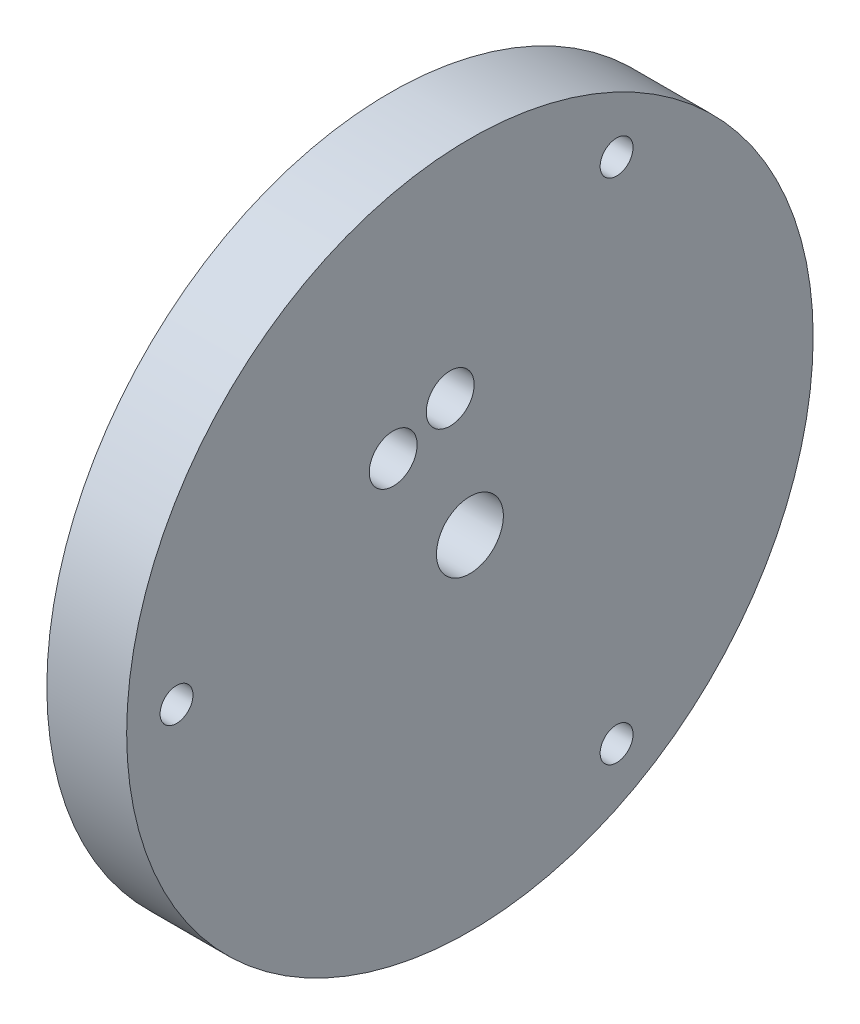
ISO-10303-21;
HEADER;
FILE_DESCRIPTION(('STEP AP214'),'2;1');
FILE_NAME('part.step','',(''),(''),'','','');
FILE_SCHEMA(('AUTOMOTIVE_DESIGN { 1 0 10303 214 1 1 1 1 }'));
ENDSEC;
DATA;
#1=APPLICATION_CONTEXT('core data for automotive mechanical design processes');
#2=APPLICATION_PROTOCOL_DEFINITION('international standard','automotive_design',2000,#1);
#3=PRODUCT_CONTEXT('',#1,'mechanical');
#4=PRODUCT('Part','Part','',(#3));
#5=PRODUCT_RELATED_PRODUCT_CATEGORY('part','',(#4));
#6=PRODUCT_DEFINITION_FORMATION('','',#4);
#7=PRODUCT_DEFINITION_CONTEXT('part definition',#1,'design');
#8=PRODUCT_DEFINITION('design','',#6,#7);
#9=PRODUCT_DEFINITION_SHAPE('','',#8);
#10=(LENGTH_UNIT() NAMED_UNIT(*) SI_UNIT(.MILLI.,.METRE.));
#11=(NAMED_UNIT(*) PLANE_ANGLE_UNIT() SI_UNIT($,.RADIAN.));
#12=(NAMED_UNIT(*) SI_UNIT($,.STERADIAN.) SOLID_ANGLE_UNIT());
#13=UNCERTAINTY_MEASURE_WITH_UNIT(LENGTH_MEASURE(1.E-05),#10,'distance_accuracy_value','');
#14=(GEOMETRIC_REPRESENTATION_CONTEXT(3) GLOBAL_UNCERTAINTY_ASSIGNED_CONTEXT((#13)) GLOBAL_UNIT_ASSIGNED_CONTEXT((#10,
#11,#12)) REPRESENTATION_CONTEXT('',''));
#15=CARTESIAN_POINT('',(0.,0.,0.));
#16=DIRECTION('',(0.,0.,1.));
#17=DIRECTION('',(1.,0.,0.));
#18=AXIS2_PLACEMENT_3D('',#15,#16,#17);
#19=CARTESIAN_POINT('',(148.7,34.4,0.));
#20=DIRECTION('',(1.,0.,0.));
#21=DIRECTION('',(0.,0.,-1.));
#22=AXIS2_PLACEMENT_3D('',#19,#20,#21);
#23=PLANE('',#22);
#24=CARTESIAN_POINT('',(148.7,0.,12.));
#25=DIRECTION('',(1.,0.,0.));
#26=DIRECTION('',(0.,0.,-1.));
#27=AXIS2_PLACEMENT_3D('',#24,#25,#26);
#28=CIRCLE('',#27,1.65);
#29=CARTESIAN_POINT('',(148.7,0.,10.35));
#30=VERTEX_POINT('',#29);
#31=EDGE_CURVE('E93',#30,#30,#28,.T.);
#32=ORIENTED_EDGE('',*,*,#31,.T.);
#33=EDGE_LOOP('',(#32));
#34=FACE_BOUND('',#33,.T.);
#35=CARTESIAN_POINT('',(148.7,-10.3923048454133,-6.));
#36=DIRECTION('',(1.,0.,0.));
#37=DIRECTION('',(0.,0.,-1.));
#38=AXIS2_PLACEMENT_3D('',#35,#36,#37);
#39=CIRCLE('',#38,1.65);
#40=CARTESIAN_POINT('',(148.7,-10.3923048454133,-7.65));
#41=VERTEX_POINT('',#40);
#42=EDGE_CURVE('E87',#41,#41,#39,.T.);
#43=ORIENTED_EDGE('',*,*,#42,.T.);
#44=EDGE_LOOP('',(#43));
#45=FACE_BOUND('',#44,.T.);
#46=CARTESIAN_POINT('',(148.7,10.3923048454133,-6.00000000000001));
#47=DIRECTION('',(1.,0.,0.));
#48=DIRECTION('',(0.,0.,-1.));
#49=AXIS2_PLACEMENT_3D('',#46,#47,#48);
#50=CIRCLE('',#49,1.65);
#51=CARTESIAN_POINT('',(148.7,10.3923048454133,-7.65000000000001));
#52=VERTEX_POINT('',#51);
#53=EDGE_CURVE('E81',#52,#52,#50,.T.);
#54=ORIENTED_EDGE('',*,*,#53,.T.);
#55=EDGE_LOOP('',(#54));
#56=FACE_BOUND('',#55,.T.);
#57=CARTESIAN_POINT('',(148.7,25.4611468712625,-14.7));
#58=DIRECTION('',(1.,0.,0.));
#59=DIRECTION('',(0.,0.,-1.));
#60=AXIS2_PLACEMENT_3D('',#57,#58,#59);
#61=CIRCLE('',#60,1.65);
#62=CARTESIAN_POINT('',(148.7,25.4611468712625,-16.35));
#63=VERTEX_POINT('',#62);
#64=EDGE_CURVE('E50',#63,#63,#61,.F.);
#65=ORIENTED_EDGE('',*,*,#64,.F.);
#66=EDGE_LOOP('',(#65));
#67=FACE_BOUND('',#66,.T.);
#68=CARTESIAN_POINT('',(148.7,-25.4611468712625,-14.7));
#69=DIRECTION('',(1.,0.,0.));
#70=DIRECTION('',(0.,0.,-1.));
#71=AXIS2_PLACEMENT_3D('',#68,#69,#70);
#72=CIRCLE('',#71,1.65);
#73=CARTESIAN_POINT('',(148.7,-25.4611468712625,-16.35));
#74=VERTEX_POINT('',#73);
#75=EDGE_CURVE('E53',#74,#74,#72,.F.);
#76=ORIENTED_EDGE('',*,*,#75,.F.);
#77=EDGE_LOOP('',(#76));
#78=FACE_BOUND('',#77,.T.);
#79=CARTESIAN_POINT('',(148.7,0.,29.4));
#80=DIRECTION('',(1.,0.,0.));
#81=DIRECTION('',(0.,0.,-1.));
#82=AXIS2_PLACEMENT_3D('',#79,#80,#81);
#83=CIRCLE('',#82,1.65);
#84=CARTESIAN_POINT('',(148.7,0.,27.75));
#85=VERTEX_POINT('',#84);
#86=EDGE_CURVE('E56',#85,#85,#83,.F.);
#87=ORIENTED_EDGE('',*,*,#86,.F.);
#88=EDGE_LOOP('',(#87));
#89=FACE_BOUND('',#88,.T.);
#90=CARTESIAN_POINT('',(148.7,10.4836474229945,7.68720604058077));
#91=DIRECTION('',(1.,0.,0.));
#92=DIRECTION('',(0.,0.,-1.));
#93=AXIS2_PLACEMENT_3D('',#90,#91,#92);
#94=CIRCLE('',#93,2.4);
#95=CARTESIAN_POINT('',(148.7,10.4836474229945,5.28720604058077));
#96=VERTEX_POINT('',#95);
#97=EDGE_CURVE('E59',#96,#96,#94,.F.);
#98=ORIENTED_EDGE('',*,*,#97,.F.);
#99=EDGE_LOOP('',(#98));
#100=FACE_BOUND('',#99,.T.);
#101=CARTESIAN_POINT('',(148.7,12.8487337040411,1.97738266469541));
#102=DIRECTION('',(1.,0.,0.));
#103=DIRECTION('',(0.,0.,-1.));
#104=AXIS2_PLACEMENT_3D('',#101,#102,#103);
#105=CIRCLE('',#104,2.4);
#106=CARTESIAN_POINT('',(148.7,12.8487337040411,-0.422617335304591));
#107=VERTEX_POINT('',#106);
#108=EDGE_CURVE('E62',#107,#107,#105,.F.);
#109=ORIENTED_EDGE('',*,*,#108,.F.);
#110=EDGE_LOOP('',(#109));
#111=FACE_BOUND('',#110,.T.);
#112=CARTESIAN_POINT('',(148.7,0.,0.));
#113=DIRECTION('',(-1.,0.,0.));
#114=DIRECTION('',(0.,0.,1.));
#115=AXIS2_PLACEMENT_3D('',#112,#113,#114);
#116=CIRCLE('',#115,3.35);
#117=CARTESIAN_POINT('',(148.7,0.,3.35));
#118=VERTEX_POINT('',#117);
#119=EDGE_CURVE('E10',#118,#118,#116,.T.);
#120=ORIENTED_EDGE('',*,*,#119,.F.);
#121=EDGE_LOOP('',(#120));
#122=FACE_BOUND('',#121,.T.);
#123=CARTESIAN_POINT('',(148.7,0.,0.));
#124=DIRECTION('',(-1.,0.,0.));
#125=DIRECTION('',(0.,0.,1.));
#126=AXIS2_PLACEMENT_3D('',#123,#124,#125);
#127=CIRCLE('',#126,34.4);
#128=CARTESIAN_POINT('',(148.7,0.,34.4));
#129=VERTEX_POINT('',#128);
#130=EDGE_CURVE('E45',#129,#129,#127,.T.);
#131=ORIENTED_EDGE('',*,*,#130,.T.);
#132=EDGE_LOOP('',(#131));
#133=FACE_BOUND('',#132,.T.);
#134=ADVANCED_FACE('F31',(#34,#45,#56,#67,#78,#89,#100,#111,#122,#133),#23,.F.);
#135=CARTESIAN_POINT('',(-110.,0.,0.));
#136=DIRECTION('',(-1.,0.,0.));
#137=DIRECTION('',(0.,0.,1.));
#138=AXIS2_PLACEMENT_3D('',#135,#136,#137);
#139=CYLINDRICAL_SURFACE('',#138,3.35);
#140=CARTESIAN_POINT('',(156.7,0.,0.));
#141=DIRECTION('',(-1.,0.,0.));
#142=DIRECTION('',(0.,0.,1.));
#143=AXIS2_PLACEMENT_3D('',#140,#141,#142);
#144=CIRCLE('',#143,3.35);
#145=CARTESIAN_POINT('',(156.7,0.,3.35));
#146=VERTEX_POINT('',#145);
#147=EDGE_CURVE('E37',#146,#146,#144,.T.);
#148=ORIENTED_EDGE('',*,*,#147,.F.);
#149=EDGE_LOOP('',(#148));
#150=FACE_BOUND('',#149,.T.);
#151=ORIENTED_EDGE('',*,*,#119,.T.);
#152=EDGE_LOOP('',(#151));
#153=FACE_BOUND('',#152,.T.);
#154=ADVANCED_FACE('F111',(#150,#153),#139,.F.);
#155=CARTESIAN_POINT('',(156.7,3.35,0.));
#156=DIRECTION('',(-1.,0.,0.));
#157=DIRECTION('',(0.,0.,1.));
#158=AXIS2_PLACEMENT_3D('',#155,#156,#157);
#159=PLANE('',#158);
#160=CARTESIAN_POINT('',(156.7,25.4611468712625,-14.7));
#161=DIRECTION('',(1.,0.,0.));
#162=DIRECTION('',(0.,0.,-1.));
#163=AXIS2_PLACEMENT_3D('',#160,#161,#162);
#164=CIRCLE('',#163,1.65);
#165=CARTESIAN_POINT('',(156.7,25.4611468712625,-16.35));
#166=VERTEX_POINT('',#165);
#167=EDGE_CURVE('E69',#166,#166,#164,.T.);
#168=ORIENTED_EDGE('',*,*,#167,.F.);
#169=EDGE_LOOP('',(#168));
#170=FACE_BOUND('',#169,.T.);
#171=CARTESIAN_POINT('',(156.7,-25.4611468712625,-14.7));
#172=DIRECTION('',(1.,0.,0.));
#173=DIRECTION('',(0.,0.,-1.));
#174=AXIS2_PLACEMENT_3D('',#171,#172,#173);
#175=CIRCLE('',#174,1.65);
#176=CARTESIAN_POINT('',(156.7,-25.4611468712625,-16.35));
#177=VERTEX_POINT('',#176);
#178=EDGE_CURVE('E72',#177,#177,#175,.T.);
#179=ORIENTED_EDGE('',*,*,#178,.F.);
#180=EDGE_LOOP('',(#179));
#181=FACE_BOUND('',#180,.T.);
#182=CARTESIAN_POINT('',(156.7,0.,29.4));
#183=DIRECTION('',(1.,0.,0.));
#184=DIRECTION('',(0.,0.,-1.));
#185=AXIS2_PLACEMENT_3D('',#182,#183,#184);
#186=CIRCLE('',#185,1.65);
#187=CARTESIAN_POINT('',(156.7,0.,27.75));
#188=VERTEX_POINT('',#187);
#189=EDGE_CURVE('E76',#188,#188,#186,.T.);
#190=ORIENTED_EDGE('',*,*,#189,.F.);
#191=EDGE_LOOP('',(#190));
#192=FACE_BOUND('',#191,.T.);
#193=CARTESIAN_POINT('',(156.7,10.4836474229945,7.68720604058077));
#194=DIRECTION('',(1.,0.,0.));
#195=DIRECTION('',(0.,0.,-1.));
#196=AXIS2_PLACEMENT_3D('',#193,#194,#195);
#197=CIRCLE('',#196,2.4);
#198=CARTESIAN_POINT('',(156.7,10.4836474229945,5.28720604058077));
#199=VERTEX_POINT('',#198);
#200=EDGE_CURVE('E68',#199,#199,#197,.T.);
#201=ORIENTED_EDGE('',*,*,#200,.F.);
#202=EDGE_LOOP('',(#201));
#203=FACE_BOUND('',#202,.T.);
#204=CARTESIAN_POINT('',(156.7,12.8487337040411,1.97738266469541));
#205=DIRECTION('',(1.,0.,0.));
#206=DIRECTION('',(0.,0.,-1.));
#207=AXIS2_PLACEMENT_3D('',#204,#205,#206);
#208=CIRCLE('',#207,2.4);
#209=CARTESIAN_POINT('',(156.7,12.8487337040411,-0.422617335304591));
#210=VERTEX_POINT('',#209);
#211=EDGE_CURVE('E65',#210,#210,#208,.T.);
#212=ORIENTED_EDGE('',*,*,#211,.F.);
#213=EDGE_LOOP('',(#212));
#214=FACE_BOUND('',#213,.T.);
#215=CARTESIAN_POINT('',(156.7,0.,0.));
#216=DIRECTION('',(-1.,0.,0.));
#217=DIRECTION('',(0.,0.,1.));
#218=AXIS2_PLACEMENT_3D('',#215,#216,#217);
#219=CIRCLE('',#218,34.4);
#220=CARTESIAN_POINT('',(156.7,0.,34.4));
#221=VERTEX_POINT('',#220);
#222=EDGE_CURVE('E41',#221,#221,#219,.T.);
#223=ORIENTED_EDGE('',*,*,#222,.F.);
#224=EDGE_LOOP('',(#223));
#225=FACE_BOUND('',#224,.T.);
#226=ORIENTED_EDGE('',*,*,#147,.T.);
#227=EDGE_LOOP('',(#226));
#228=FACE_BOUND('',#227,.T.);
#229=ADVANCED_FACE('F116',(#170,#181,#192,#203,#214,#225,#228),#159,.F.);
#230=CARTESIAN_POINT('',(-110.,0.,0.));
#231=DIRECTION('',(-1.,0.,0.));
#232=DIRECTION('',(0.,0.,1.));
#233=AXIS2_PLACEMENT_3D('',#230,#231,#232);
#234=CYLINDRICAL_SURFACE('',#233,34.4);
#235=ORIENTED_EDGE('',*,*,#130,.F.);
#236=EDGE_LOOP('',(#235));
#237=FACE_BOUND('',#236,.T.);
#238=ORIENTED_EDGE('',*,*,#222,.T.);
#239=EDGE_LOOP('',(#238));
#240=FACE_BOUND('',#239,.T.);
#241=ADVANCED_FACE('F137',(#237,#240),#234,.T.);
#242=CARTESIAN_POINT('',(156.7,12.8487337040411,1.97738266469541));
#243=DIRECTION('',(-1.,0.,0.));
#244=DIRECTION('',(0.,0.,1.));
#245=AXIS2_PLACEMENT_3D('',#242,#243,#244);
#246=CYLINDRICAL_SURFACE('',#245,2.4);
#247=ORIENTED_EDGE('',*,*,#211,.T.);
#248=EDGE_LOOP('',(#247));
#249=FACE_BOUND('',#248,.T.);
#250=ORIENTED_EDGE('',*,*,#108,.T.);
#251=EDGE_LOOP('',(#250));
#252=FACE_BOUND('',#251,.T.);
#253=ADVANCED_FACE('F140',(#249,#252),#246,.F.);
#254=CARTESIAN_POINT('',(156.7,10.4836474229945,7.68720604058077));
#255=DIRECTION('',(-1.,0.,0.));
#256=DIRECTION('',(0.,0.,1.));
#257=AXIS2_PLACEMENT_3D('',#254,#255,#256);
#258=CYLINDRICAL_SURFACE('',#257,2.4);
#259=ORIENTED_EDGE('',*,*,#200,.T.);
#260=EDGE_LOOP('',(#259));
#261=FACE_BOUND('',#260,.T.);
#262=ORIENTED_EDGE('',*,*,#97,.T.);
#263=EDGE_LOOP('',(#262));
#264=FACE_BOUND('',#263,.T.);
#265=ADVANCED_FACE('F154',(#261,#264),#258,.F.);
#266=CARTESIAN_POINT('',(156.7,0.,29.4));
#267=DIRECTION('',(-1.,0.,0.));
#268=DIRECTION('',(0.,0.,1.));
#269=AXIS2_PLACEMENT_3D('',#266,#267,#268);
#270=CYLINDRICAL_SURFACE('',#269,1.65);
#271=ORIENTED_EDGE('',*,*,#189,.T.);
#272=EDGE_LOOP('',(#271));
#273=FACE_BOUND('',#272,.T.);
#274=ORIENTED_EDGE('',*,*,#86,.T.);
#275=EDGE_LOOP('',(#274));
#276=FACE_BOUND('',#275,.T.);
#277=ADVANCED_FACE('F164',(#273,#276),#270,.F.);
#278=CARTESIAN_POINT('',(156.7,-25.4611468712625,-14.7));
#279=DIRECTION('',(-1.,0.,0.));
#280=DIRECTION('',(0.,0.,1.));
#281=AXIS2_PLACEMENT_3D('',#278,#279,#280);
#282=CYLINDRICAL_SURFACE('',#281,1.65);
#283=ORIENTED_EDGE('',*,*,#178,.T.);
#284=EDGE_LOOP('',(#283));
#285=FACE_BOUND('',#284,.T.);
#286=ORIENTED_EDGE('',*,*,#75,.T.);
#287=EDGE_LOOP('',(#286));
#288=FACE_BOUND('',#287,.T.);
#289=ADVANCED_FACE('F160',(#285,#288),#282,.F.);
#290=CARTESIAN_POINT('',(156.7,25.4611468712625,-14.7));
#291=DIRECTION('',(-1.,0.,0.));
#292=DIRECTION('',(0.,0.,1.));
#293=AXIS2_PLACEMENT_3D('',#290,#291,#292);
#294=CYLINDRICAL_SURFACE('',#293,1.65);
#295=ORIENTED_EDGE('',*,*,#167,.T.);
#296=EDGE_LOOP('',(#295));
#297=FACE_BOUND('',#296,.T.);
#298=ORIENTED_EDGE('',*,*,#64,.T.);
#299=EDGE_LOOP('',(#298));
#300=FACE_BOUND('',#299,.T.);
#301=ADVANCED_FACE('F156',(#297,#300),#294,.F.);
#302=CARTESIAN_POINT('',(154.7,10.3923048454133,-6.00000000000001));
#303=DIRECTION('',(-1.,0.,0.));
#304=DIRECTION('',(0.,0.,1.));
#305=AXIS2_PLACEMENT_3D('',#302,#303,#304);
#306=CYLINDRICAL_SURFACE('',#305,1.65);
#307=CARTESIAN_POINT('',(154.7,10.3923048454133,-6.00000000000001));
#308=DIRECTION('',(1.,0.,0.));
#309=DIRECTION('',(0.,0.,-1.));
#310=AXIS2_PLACEMENT_3D('',#307,#308,#309);
#311=CIRCLE('',#310,1.65);
#312=CARTESIAN_POINT('',(154.7,10.3923048454133,-7.65000000000001));
#313=VERTEX_POINT('',#312);
#314=EDGE_CURVE('E84',#313,#313,#311,.T.);
#315=ORIENTED_EDGE('',*,*,#314,.T.);
#316=EDGE_LOOP('',(#315));
#317=FACE_BOUND('',#316,.T.);
#318=ORIENTED_EDGE('',*,*,#53,.F.);
#319=EDGE_LOOP('',(#318));
#320=FACE_BOUND('',#319,.T.);
#321=ADVANCED_FACE('F159',(#317,#320),#306,.F.);
#322=CARTESIAN_POINT('',(154.7,10.3923048454133,-6.00000000000001));
#323=DIRECTION('',(1.,0.,0.));
#324=DIRECTION('',(0.,0.,-1.));
#325=AXIS2_PLACEMENT_3D('',#322,#323,#324);
#326=PLANE('',#325);
#327=ORIENTED_EDGE('',*,*,#314,.F.);
#328=EDGE_LOOP('',(#327));
#329=FACE_BOUND('',#328,.T.);
#330=ADVANCED_FACE('F174',(#329),#326,.F.);
#331=CARTESIAN_POINT('',(154.7,-10.3923048454133,-6.));
#332=DIRECTION('',(-1.,0.,0.));
#333=DIRECTION('',(0.,0.,1.));
#334=AXIS2_PLACEMENT_3D('',#331,#332,#333);
#335=CYLINDRICAL_SURFACE('',#334,1.65);
#336=CARTESIAN_POINT('',(154.7,-10.3923048454133,-6.));
#337=DIRECTION('',(1.,0.,0.));
#338=DIRECTION('',(0.,0.,-1.));
#339=AXIS2_PLACEMENT_3D('',#336,#337,#338);
#340=CIRCLE('',#339,1.65);
#341=CARTESIAN_POINT('',(154.7,-10.3923048454133,-7.65));
#342=VERTEX_POINT('',#341);
#343=EDGE_CURVE('E90',#342,#342,#340,.T.);
#344=ORIENTED_EDGE('',*,*,#343,.T.);
#345=EDGE_LOOP('',(#344));
#346=FACE_BOUND('',#345,.T.);
#347=ORIENTED_EDGE('',*,*,#42,.F.);
#348=EDGE_LOOP('',(#347));
#349=FACE_BOUND('',#348,.T.);
#350=ADVANCED_FACE('F178',(#346,#349),#335,.F.);
#351=CARTESIAN_POINT('',(154.7,-10.3923048454133,-6.));
#352=DIRECTION('',(1.,0.,0.));
#353=DIRECTION('',(0.,0.,-1.));
#354=AXIS2_PLACEMENT_3D('',#351,#352,#353);
#355=PLANE('',#354);
#356=ORIENTED_EDGE('',*,*,#343,.F.);
#357=EDGE_LOOP('',(#356));
#358=FACE_BOUND('',#357,.T.);
#359=ADVANCED_FACE('F108',(#358),#355,.F.);
#360=CARTESIAN_POINT('',(154.7,0.,12.));
#361=DIRECTION('',(-1.,0.,0.));
#362=DIRECTION('',(0.,0.,1.));
#363=AXIS2_PLACEMENT_3D('',#360,#361,#362);
#364=CYLINDRICAL_SURFACE('',#363,1.65);
#365=CARTESIAN_POINT('',(154.7,0.,12.));
#366=DIRECTION('',(1.,0.,0.));
#367=DIRECTION('',(0.,0.,-1.));
#368=AXIS2_PLACEMENT_3D('',#365,#366,#367);
#369=CIRCLE('',#368,1.65);
#370=CARTESIAN_POINT('',(154.7,0.,10.35));
#371=VERTEX_POINT('',#370);
#372=EDGE_CURVE('E73',#371,#371,#369,.T.);
#373=ORIENTED_EDGE('',*,*,#372,.T.);
#374=EDGE_LOOP('',(#373));
#375=FACE_BOUND('',#374,.T.);
#376=ORIENTED_EDGE('',*,*,#31,.F.);
#377=EDGE_LOOP('',(#376));
#378=FACE_BOUND('',#377,.T.);
#379=ADVANCED_FACE('F99',(#375,#378),#364,.F.);
#380=CARTESIAN_POINT('',(154.7,0.,12.));
#381=DIRECTION('',(1.,0.,0.));
#382=DIRECTION('',(0.,0.,-1.));
#383=AXIS2_PLACEMENT_3D('',#380,#381,#382);
#384=PLANE('',#383);
#385=ORIENTED_EDGE('',*,*,#372,.F.);
#386=EDGE_LOOP('',(#385));
#387=FACE_BOUND('',#386,.T.);
#388=ADVANCED_FACE('F102',(#387),#384,.F.);
#389=CLOSED_SHELL('',(#134,#154,#229,#241,#253,#265,#277,#289,#301,#321,#330,#350,#359,#379,#388));
#390=MANIFOLD_SOLID_BREP('B2',#389);
#391=ADVANCED_BREP_SHAPE_REPRESENTATION('',(#18,#390),#14);
#392=SHAPE_DEFINITION_REPRESENTATION(#9,#391);
ENDSEC;
END-ISO-10303-21;
